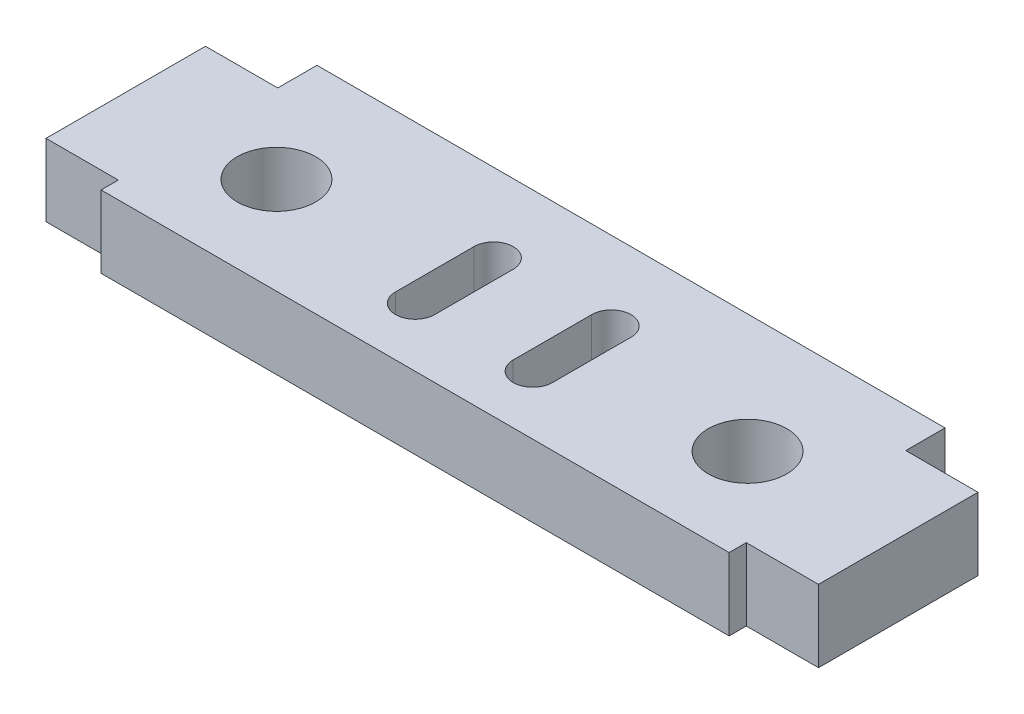
ISO-10303-21;
HEADER;
FILE_DESCRIPTION(('STEP AP214'),'2;1');
FILE_NAME('part.step','',(''),(''),'','','');
FILE_SCHEMA(('AUTOMOTIVE_DESIGN { 1 0 10303 214 1 1 1 1 }'));
ENDSEC;
DATA;
#1=APPLICATION_CONTEXT('core data for automotive mechanical design processes');
#2=APPLICATION_PROTOCOL_DEFINITION('international standard','automotive_design',2000,#1);
#3=PRODUCT_CONTEXT('',#1,'mechanical');
#4=PRODUCT('Part','Part','',(#3));
#5=PRODUCT_RELATED_PRODUCT_CATEGORY('part','',(#4));
#6=PRODUCT_DEFINITION_FORMATION('','',#4);
#7=PRODUCT_DEFINITION_CONTEXT('part definition',#1,'design');
#8=PRODUCT_DEFINITION('design','',#6,#7);
#9=PRODUCT_DEFINITION_SHAPE('','',#8);
#10=(LENGTH_UNIT() NAMED_UNIT(*) SI_UNIT(.MILLI.,.METRE.));
#11=(NAMED_UNIT(*) PLANE_ANGLE_UNIT() SI_UNIT($,.RADIAN.));
#12=(NAMED_UNIT(*) SI_UNIT($,.STERADIAN.) SOLID_ANGLE_UNIT());
#13=UNCERTAINTY_MEASURE_WITH_UNIT(LENGTH_MEASURE(1.E-05),#10,'distance_accuracy_value','');
#14=(GEOMETRIC_REPRESENTATION_CONTEXT(3) GLOBAL_UNCERTAINTY_ASSIGNED_CONTEXT((#13)) GLOBAL_UNIT_ASSIGNED_CONTEXT((#10,
#11,#12)) REPRESENTATION_CONTEXT('',''));
#15=CARTESIAN_POINT('',(0.,0.,0.));
#16=DIRECTION('',(0.,0.,1.));
#17=DIRECTION('',(1.,0.,0.));
#18=AXIS2_PLACEMENT_3D('',#15,#16,#17);
#19=CARTESIAN_POINT('',(-25.4,5.842,-6.450000054));
#20=DIRECTION('',(1.,0.,0.));
#21=DIRECTION('',(0.,0.,-1.));
#22=AXIS2_PLACEMENT_3D('',#19,#20,#21);
#23=PLANE('',#22);
#24=DIRECTION('',(0.,0.,1.));
#25=VECTOR('',#24,1.);
#26=CARTESIAN_POINT('',(-25.4,0.,-6.450000054));
#27=LINE('',#26,#25);
#28=CARTESIAN_POINT('',(-25.4,0.,-9.625000054));
#29=VERTEX_POINT('',#28);
#30=CARTESIAN_POINT('',(-25.4,0.,-6.450000054));
#31=VERTEX_POINT('',#30);
#32=EDGE_CURVE('E195',#29,#31,#27,.T.);
#33=ORIENTED_EDGE('',*,*,#32,.T.);
#34=DIRECTION('',(0.,-1.,0.));
#35=VECTOR('',#34,1.);
#36=CARTESIAN_POINT('',(-25.4,5.842,-6.450000054));
#37=LINE('',#36,#35);
#38=CARTESIAN_POINT('',(-25.4,5.842,-6.450000054));
#39=VERTEX_POINT('',#38);
#40=EDGE_CURVE('E11',#39,#31,#37,.T.);
#41=ORIENTED_EDGE('',*,*,#40,.F.);
#42=DIRECTION('',(0.,0.,1.));
#43=VECTOR('',#42,1.);
#44=CARTESIAN_POINT('',(-25.4,5.842,-6.450000054));
#45=LINE('',#44,#43);
#46=CARTESIAN_POINT('',(-25.4,5.842,-9.625000054));
#47=VERTEX_POINT('',#46);
#48=EDGE_CURVE('E182',#47,#39,#45,.T.);
#49=ORIENTED_EDGE('',*,*,#48,.F.);
#50=DIRECTION('',(0.,-1.,0.));
#51=VECTOR('',#50,1.);
#52=CARTESIAN_POINT('',(-25.4,56.6667986346232,-9.625000054));
#53=LINE('',#52,#51);
#54=EDGE_CURVE('E197',#47,#29,#53,.T.);
#55=ORIENTED_EDGE('',*,*,#54,.T.);
#56=EDGE_LOOP('',(#33,#41,#49,#55));
#57=FACE_BOUND('',#56,.T.);
#58=ADVANCED_FACE('F34',(#57),#23,.F.);
#59=CARTESIAN_POINT('',(-31.242,5.842,-6.450000054));
#60=DIRECTION('',(0.,0.,1.));
#61=DIRECTION('',(1.,0.,0.));
#62=AXIS2_PLACEMENT_3D('',#59,#60,#61);
#63=PLANE('',#62);
#64=DIRECTION('',(-1.,0.,0.));
#65=VECTOR('',#64,1.);
#66=CARTESIAN_POINT('',(-31.242,0.,-6.450000054));
#67=LINE('',#66,#65);
#68=CARTESIAN_POINT('',(-31.242,0.,-6.450000054));
#69=VERTEX_POINT('',#68);
#70=EDGE_CURVE('E297',#31,#69,#67,.T.);
#71=ORIENTED_EDGE('',*,*,#70,.T.);
#72=DIRECTION('',(0.,-1.,0.));
#73=VECTOR('',#72,1.);
#74=CARTESIAN_POINT('',(-31.242,5.842,-6.450000054));
#75=LINE('',#74,#73);
#76=CARTESIAN_POINT('',(-31.242,5.842,-6.450000054));
#77=VERTEX_POINT('',#76);
#78=EDGE_CURVE('E41',#77,#69,#75,.T.);
#79=ORIENTED_EDGE('',*,*,#78,.F.);
#80=DIRECTION('',(-1.,0.,0.));
#81=VECTOR('',#80,1.);
#82=CARTESIAN_POINT('',(-31.242,5.842,-6.450000054));
#83=LINE('',#82,#81);
#84=EDGE_CURVE('E276',#39,#77,#83,.T.);
#85=ORIENTED_EDGE('',*,*,#84,.F.);
#86=ORIENTED_EDGE('',*,*,#40,.T.);
#87=EDGE_LOOP('',(#71,#79,#85,#86));
#88=FACE_BOUND('',#87,.T.);
#89=ADVANCED_FACE('F359',(#88),#63,.F.);
#90=CARTESIAN_POINT('',(-31.242,5.842,6.45000005400001));
#91=DIRECTION('',(1.,0.,0.));
#92=DIRECTION('',(0.,0.,-1.));
#93=AXIS2_PLACEMENT_3D('',#90,#91,#92);
#94=PLANE('',#93);
#95=DIRECTION('',(0.,0.,1.));
#96=VECTOR('',#95,1.);
#97=CARTESIAN_POINT('',(-31.242,0.,6.45000005400001));
#98=LINE('',#97,#96);
#99=CARTESIAN_POINT('',(-31.242,0.,6.45000005400001));
#100=VERTEX_POINT('',#99);
#101=EDGE_CURVE('E299',#69,#100,#98,.T.);
#102=ORIENTED_EDGE('',*,*,#101,.T.);
#103=DIRECTION('',(0.,-1.,0.));
#104=VECTOR('',#103,1.);
#105=CARTESIAN_POINT('',(-31.242,5.842,6.45000005400001));
#106=LINE('',#105,#104);
#107=CARTESIAN_POINT('',(-31.242,5.842,6.45000005400001));
#108=VERTEX_POINT('',#107);
#109=EDGE_CURVE('E333',#108,#100,#106,.T.);
#110=ORIENTED_EDGE('',*,*,#109,.F.);
#111=DIRECTION('',(0.,0.,1.));
#112=VECTOR('',#111,1.);
#113=CARTESIAN_POINT('',(-31.242,5.842,6.45000005400001));
#114=LINE('',#113,#112);
#115=EDGE_CURVE('E278',#77,#108,#114,.T.);
#116=ORIENTED_EDGE('',*,*,#115,.F.);
#117=ORIENTED_EDGE('',*,*,#78,.T.);
#118=EDGE_LOOP('',(#102,#110,#116,#117));
#119=FACE_BOUND('',#118,.T.);
#120=ADVANCED_FACE('F340',(#119),#94,.F.);
#121=CARTESIAN_POINT('',(-31.242,5.842,6.45000005400001));
#122=DIRECTION('',(0.,0.,-1.));
#123=DIRECTION('',(-1.,0.,0.));
#124=AXIS2_PLACEMENT_3D('',#121,#122,#123);
#125=PLANE('',#124);
#126=DIRECTION('',(1.,0.,0.));
#127=VECTOR('',#126,1.);
#128=CARTESIAN_POINT('',(-31.242,0.,6.45000005400001));
#129=LINE('',#128,#127);
#130=CARTESIAN_POINT('',(-25.4,0.,6.45000005400001));
#131=VERTEX_POINT('',#130);
#132=EDGE_CURVE('E301',#100,#131,#129,.T.);
#133=ORIENTED_EDGE('',*,*,#132,.T.);
#134=DIRECTION('',(0.,-1.,0.));
#135=VECTOR('',#134,1.);
#136=CARTESIAN_POINT('',(-25.4,5.842,6.45000005400001));
#137=LINE('',#136,#135);
#138=CARTESIAN_POINT('',(-25.4,5.842,6.45000005400001));
#139=VERTEX_POINT('',#138);
#140=EDGE_CURVE('E330',#139,#131,#137,.T.);
#141=ORIENTED_EDGE('',*,*,#140,.F.);
#142=DIRECTION('',(1.,0.,0.));
#143=VECTOR('',#142,1.);
#144=CARTESIAN_POINT('',(-31.242,5.842,6.45000005400001));
#145=LINE('',#144,#143);
#146=EDGE_CURVE('E280',#108,#139,#145,.T.);
#147=ORIENTED_EDGE('',*,*,#146,.F.);
#148=ORIENTED_EDGE('',*,*,#109,.T.);
#149=EDGE_LOOP('',(#133,#141,#147,#148));
#150=FACE_BOUND('',#149,.T.);
#151=ADVANCED_FACE('F348',(#150),#125,.F.);
#152=CARTESIAN_POINT('',(-25.4,5.842,7.837499946));
#153=DIRECTION('',(1.,0.,0.));
#154=DIRECTION('',(0.,0.,-1.));
#155=AXIS2_PLACEMENT_3D('',#152,#153,#154);
#156=PLANE('',#155);
#157=DIRECTION('',(0.,0.,1.));
#158=VECTOR('',#157,1.);
#159=CARTESIAN_POINT('',(-25.4,0.,7.837499946));
#160=LINE('',#159,#158);
#161=CARTESIAN_POINT('',(-25.4,0.,7.837499946));
#162=VERTEX_POINT('',#161);
#163=EDGE_CURVE('E303',#131,#162,#160,.T.);
#164=ORIENTED_EDGE('',*,*,#163,.T.);
#165=DIRECTION('',(0.,-1.,0.));
#166=VECTOR('',#165,1.);
#167=CARTESIAN_POINT('',(-25.4,5.842,7.837499946));
#168=LINE('',#167,#166);
#169=CARTESIAN_POINT('',(-25.4,5.842,7.837499946));
#170=VERTEX_POINT('',#169);
#171=EDGE_CURVE('E327',#170,#162,#168,.T.);
#172=ORIENTED_EDGE('',*,*,#171,.F.);
#173=DIRECTION('',(0.,0.,1.));
#174=VECTOR('',#173,1.);
#175=CARTESIAN_POINT('',(-25.4,5.842,7.837499946));
#176=LINE('',#175,#174);
#177=EDGE_CURVE('E282',#139,#170,#176,.T.);
#178=ORIENTED_EDGE('',*,*,#177,.F.);
#179=ORIENTED_EDGE('',*,*,#140,.T.);
#180=EDGE_LOOP('',(#164,#172,#178,#179));
#181=FACE_BOUND('',#180,.T.);
#182=ADVANCED_FACE('F352',(#181),#156,.F.);
#183=CARTESIAN_POINT('',(25.4,5.842,7.837499946));
#184=DIRECTION('',(0.,0.,-1.));
#185=DIRECTION('',(-1.,0.,0.));
#186=AXIS2_PLACEMENT_3D('',#183,#184,#185);
#187=PLANE('',#186);
#188=DIRECTION('',(1.,0.,0.));
#189=VECTOR('',#188,1.);
#190=CARTESIAN_POINT('',(25.4,0.,7.837499946));
#191=LINE('',#190,#189);
#192=CARTESIAN_POINT('',(25.4,0.,7.837499946));
#193=VERTEX_POINT('',#192);
#194=EDGE_CURVE('E305',#162,#193,#191,.T.);
#195=ORIENTED_EDGE('',*,*,#194,.T.);
#196=DIRECTION('',(0.,-1.,0.));
#197=VECTOR('',#196,1.);
#198=CARTESIAN_POINT('',(25.4,5.842,7.837499946));
#199=LINE('',#198,#197);
#200=CARTESIAN_POINT('',(25.4,5.842,7.837499946));
#201=VERTEX_POINT('',#200);
#202=EDGE_CURVE('E324',#201,#193,#199,.T.);
#203=ORIENTED_EDGE('',*,*,#202,.F.);
#204=DIRECTION('',(1.,0.,0.));
#205=VECTOR('',#204,1.);
#206=CARTESIAN_POINT('',(25.4,5.842,7.837499946));
#207=LINE('',#206,#205);
#208=EDGE_CURVE('E284',#170,#201,#207,.T.);
#209=ORIENTED_EDGE('',*,*,#208,.F.);
#210=ORIENTED_EDGE('',*,*,#171,.T.);
#211=EDGE_LOOP('',(#195,#203,#209,#210));
#212=FACE_BOUND('',#211,.T.);
#213=ADVANCED_FACE('F380',(#212),#187,.F.);
#214=CARTESIAN_POINT('',(25.4,5.842,7.837499946));
#215=DIRECTION('',(-1.,0.,0.));
#216=DIRECTION('',(0.,0.,1.));
#217=AXIS2_PLACEMENT_3D('',#214,#215,#216);
#218=PLANE('',#217);
#219=DIRECTION('',(0.,0.,-1.));
#220=VECTOR('',#219,1.);
#221=CARTESIAN_POINT('',(25.4,0.,7.837499946));
#222=LINE('',#221,#220);
#223=CARTESIAN_POINT('',(25.4,0.,6.45000005400002));
#224=VERTEX_POINT('',#223);
#225=EDGE_CURVE('E307',#193,#224,#222,.T.);
#226=ORIENTED_EDGE('',*,*,#225,.T.);
#227=DIRECTION('',(0.,-1.,0.));
#228=VECTOR('',#227,1.);
#229=CARTESIAN_POINT('',(25.4,5.842,6.45000005400002));
#230=LINE('',#229,#228);
#231=CARTESIAN_POINT('',(25.4,5.842,6.45000005400002));
#232=VERTEX_POINT('',#231);
#233=EDGE_CURVE('E321',#232,#224,#230,.T.);
#234=ORIENTED_EDGE('',*,*,#233,.F.);
#235=DIRECTION('',(0.,0.,-1.));
#236=VECTOR('',#235,1.);
#237=CARTESIAN_POINT('',(25.4,5.842,7.837499946));
#238=LINE('',#237,#236);
#239=EDGE_CURVE('E286',#201,#232,#238,.T.);
#240=ORIENTED_EDGE('',*,*,#239,.F.);
#241=ORIENTED_EDGE('',*,*,#202,.T.);
#242=EDGE_LOOP('',(#226,#234,#240,#241));
#243=FACE_BOUND('',#242,.T.);
#244=ADVANCED_FACE('F378',(#243),#218,.F.);
#245=CARTESIAN_POINT('',(31.242,5.842,6.45000005399999));
#246=DIRECTION('',(0.,0.,-1.));
#247=DIRECTION('',(-1.,0.,0.));
#248=AXIS2_PLACEMENT_3D('',#245,#246,#247);
#249=PLANE('',#248);
#250=DIRECTION('',(1.,0.,0.));
#251=VECTOR('',#250,1.);
#252=CARTESIAN_POINT('',(31.242,0.,6.45000005399999));
#253=LINE('',#252,#251);
#254=CARTESIAN_POINT('',(31.242,0.,6.45000005399999));
#255=VERTEX_POINT('',#254);
#256=EDGE_CURVE('E309',#224,#255,#253,.T.);
#257=ORIENTED_EDGE('',*,*,#256,.T.);
#258=DIRECTION('',(0.,-1.,0.));
#259=VECTOR('',#258,1.);
#260=CARTESIAN_POINT('',(31.242,5.842,6.45000005399999));
#261=LINE('',#260,#259);
#262=CARTESIAN_POINT('',(31.242,5.842,6.45000005399999));
#263=VERTEX_POINT('',#262);
#264=EDGE_CURVE('E318',#263,#255,#261,.T.);
#265=ORIENTED_EDGE('',*,*,#264,.F.);
#266=DIRECTION('',(1.,0.,0.));
#267=VECTOR('',#266,1.);
#268=CARTESIAN_POINT('',(31.242,5.842,6.45000005399999));
#269=LINE('',#268,#267);
#270=EDGE_CURVE('E288',#232,#263,#269,.T.);
#271=ORIENTED_EDGE('',*,*,#270,.F.);
#272=ORIENTED_EDGE('',*,*,#233,.T.);
#273=EDGE_LOOP('',(#257,#265,#271,#272));
#274=FACE_BOUND('',#273,.T.);
#275=ADVANCED_FACE('F374',(#274),#249,.F.);
#276=CARTESIAN_POINT('',(31.242,5.842,6.45000005399999));
#277=DIRECTION('',(-1.,0.,0.));
#278=DIRECTION('',(0.,0.,1.));
#279=AXIS2_PLACEMENT_3D('',#276,#277,#278);
#280=PLANE('',#279);
#281=DIRECTION('',(0.,0.,-1.));
#282=VECTOR('',#281,1.);
#283=CARTESIAN_POINT('',(31.242,0.,6.45000005399999));
#284=LINE('',#283,#282);
#285=CARTESIAN_POINT('',(31.242,0.,-6.45000005400001));
#286=VERTEX_POINT('',#285);
#287=EDGE_CURVE('E311',#255,#286,#284,.T.);
#288=ORIENTED_EDGE('',*,*,#287,.T.);
#289=DIRECTION('',(0.,-1.,0.));
#290=VECTOR('',#289,1.);
#291=CARTESIAN_POINT('',(31.242,5.842,-6.45000005400001));
#292=LINE('',#291,#290);
#293=CARTESIAN_POINT('',(31.242,5.842,-6.45000005400001));
#294=VERTEX_POINT('',#293);
#295=EDGE_CURVE('E315',#294,#286,#292,.T.);
#296=ORIENTED_EDGE('',*,*,#295,.F.);
#297=DIRECTION('',(0.,0.,-1.));
#298=VECTOR('',#297,1.);
#299=CARTESIAN_POINT('',(31.242,5.842,6.45000005399999));
#300=LINE('',#299,#298);
#301=EDGE_CURVE('E290',#263,#294,#300,.T.);
#302=ORIENTED_EDGE('',*,*,#301,.F.);
#303=ORIENTED_EDGE('',*,*,#264,.T.);
#304=EDGE_LOOP('',(#288,#296,#302,#303));
#305=FACE_BOUND('',#304,.T.);
#306=ADVANCED_FACE('F370',(#305),#280,.F.);
#307=CARTESIAN_POINT('',(31.242,5.842,-6.45000005400001));
#308=DIRECTION('',(0.,0.,1.));
#309=DIRECTION('',(1.,0.,0.));
#310=AXIS2_PLACEMENT_3D('',#307,#308,#309);
#311=PLANE('',#310);
#312=DIRECTION('',(-1.,0.,0.));
#313=VECTOR('',#312,1.);
#314=CARTESIAN_POINT('',(31.242,0.,-6.45000005400001));
#315=LINE('',#314,#313);
#316=CARTESIAN_POINT('',(25.4,0.,-6.450000054));
#317=VERTEX_POINT('',#316);
#318=EDGE_CURVE('E183',#286,#317,#315,.T.);
#319=ORIENTED_EDGE('',*,*,#318,.T.);
#320=DIRECTION('',(0.,-1.,0.));
#321=VECTOR('',#320,1.);
#322=CARTESIAN_POINT('',(25.4,5.842,-6.450000054));
#323=LINE('',#322,#321);
#324=CARTESIAN_POINT('',(25.4,5.842,-6.450000054));
#325=VERTEX_POINT('',#324);
#326=EDGE_CURVE('E178',#325,#317,#323,.T.);
#327=ORIENTED_EDGE('',*,*,#326,.F.);
#328=DIRECTION('',(-1.,0.,0.));
#329=VECTOR('',#328,1.);
#330=CARTESIAN_POINT('',(31.242,5.842,-6.45000005400001));
#331=LINE('',#330,#329);
#332=EDGE_CURVE('E292',#294,#325,#331,.T.);
#333=ORIENTED_EDGE('',*,*,#332,.F.);
#334=ORIENTED_EDGE('',*,*,#295,.T.);
#335=EDGE_LOOP('',(#319,#327,#333,#334));
#336=FACE_BOUND('',#335,.T.);
#337=ADVANCED_FACE('F365',(#336),#311,.F.);
#338=CARTESIAN_POINT('',(25.4,5.842,-6.450000054));
#339=DIRECTION('',(-1.,0.,0.));
#340=DIRECTION('',(0.,0.,1.));
#341=AXIS2_PLACEMENT_3D('',#338,#339,#340);
#342=PLANE('',#341);
#343=DIRECTION('',(0.,0.,-1.));
#344=VECTOR('',#343,1.);
#345=CARTESIAN_POINT('',(25.4,0.,-6.450000054));
#346=LINE('',#345,#344);
#347=CARTESIAN_POINT('',(25.4,0.,-9.625000054));
#348=VERTEX_POINT('',#347);
#349=EDGE_CURVE('E171',#317,#348,#346,.T.);
#350=ORIENTED_EDGE('',*,*,#349,.T.);
#351=DIRECTION('',(0.,-1.,0.));
#352=VECTOR('',#351,1.);
#353=CARTESIAN_POINT('',(25.4,56.6667986346232,-9.625000054));
#354=LINE('',#353,#352);
#355=CARTESIAN_POINT('',(25.4,5.842,-9.625000054));
#356=VERTEX_POINT('',#355);
#357=EDGE_CURVE('E175',#356,#348,#354,.T.);
#358=ORIENTED_EDGE('',*,*,#357,.F.);
#359=DIRECTION('',(0.,0.,-1.));
#360=VECTOR('',#359,1.);
#361=CARTESIAN_POINT('',(25.4,5.842,-6.450000054));
#362=LINE('',#361,#360);
#363=EDGE_CURVE('E294',#325,#356,#362,.T.);
#364=ORIENTED_EDGE('',*,*,#363,.F.);
#365=ORIENTED_EDGE('',*,*,#326,.T.);
#366=EDGE_LOOP('',(#350,#358,#364,#365));
#367=FACE_BOUND('',#366,.T.);
#368=ADVANCED_FACE('F173',(#367),#342,.F.);
#369=CARTESIAN_POINT('',(0.,5.842,0.));
#370=DIRECTION('',(0.,1.,0.));
#371=DIRECTION('',(0.,0.,1.));
#372=AXIS2_PLACEMENT_3D('',#369,#370,#371);
#373=PLANE('',#372);
#374=CARTESIAN_POINT('',(4.7625,5.842,3.07499994599999));
#375=DIRECTION('',(0.,-1.,0.));
#376=DIRECTION('',(0.,0.,1.));
#377=AXIS2_PLACEMENT_3D('',#374,#375,#376);
#378=CIRCLE('',#377,1.5875);
#379=CARTESIAN_POINT('',(6.35,5.842,3.07499994599999));
#380=VERTEX_POINT('',#379);
#381=CARTESIAN_POINT('',(3.175,5.842,3.07499994599999));
#382=VERTEX_POINT('',#381);
#383=EDGE_CURVE('E202',#380,#382,#378,.T.);
#384=ORIENTED_EDGE('',*,*,#383,.T.);
#385=DIRECTION('',(0.,0.,-1.));
#386=VECTOR('',#385,1.);
#387=CARTESIAN_POINT('',(3.175,5.842,3.07499994599999));
#388=LINE('',#387,#386);
#389=CARTESIAN_POINT('',(3.175,5.842,-3.27500005400001));
#390=VERTEX_POINT('',#389);
#391=EDGE_CURVE('E205',#382,#390,#388,.T.);
#392=ORIENTED_EDGE('',*,*,#391,.T.);
#393=CARTESIAN_POINT('',(4.7625,5.842,-3.27500005400001));
#394=DIRECTION('',(0.,-1.,0.));
#395=DIRECTION('',(0.,0.,1.));
#396=AXIS2_PLACEMENT_3D('',#393,#394,#395);
#397=CIRCLE('',#396,1.5875);
#398=CARTESIAN_POINT('',(6.35,5.842,-3.27500005400001));
#399=VERTEX_POINT('',#398);
#400=EDGE_CURVE('E48',#390,#399,#397,.T.);
#401=ORIENTED_EDGE('',*,*,#400,.T.);
#402=DIRECTION('',(0.,0.,1.));
#403=VECTOR('',#402,1.);
#404=CARTESIAN_POINT('',(6.35,5.842,3.07499994599999));
#405=LINE('',#404,#403);
#406=EDGE_CURVE('E210',#399,#380,#405,.T.);
#407=ORIENTED_EDGE('',*,*,#406,.T.);
#408=EDGE_LOOP('',(#384,#392,#401,#407));
#409=FACE_BOUND('',#408,.T.);
#410=CARTESIAN_POINT('',(-4.7625,5.842,3.07499994599999));
#411=DIRECTION('',(0.,-1.,0.));
#412=DIRECTION('',(0.,0.,-1.));
#413=AXIS2_PLACEMENT_3D('',#410,#411,#412);
#414=CIRCLE('',#413,1.5875);
#415=CARTESIAN_POINT('',(-3.175,5.842,3.07499994599999));
#416=VERTEX_POINT('',#415);
#417=CARTESIAN_POINT('',(-6.35,5.842,3.07499994599999));
#418=VERTEX_POINT('',#417);
#419=EDGE_CURVE('E231',#416,#418,#414,.T.);
#420=ORIENTED_EDGE('',*,*,#419,.T.);
#421=DIRECTION('',(0.,0.,-1.));
#422=VECTOR('',#421,1.);
#423=CARTESIAN_POINT('',(-6.35,5.842,3.07499994599999));
#424=LINE('',#423,#422);
#425=CARTESIAN_POINT('',(-6.35,5.842,-3.27500005400001));
#426=VERTEX_POINT('',#425);
#427=EDGE_CURVE('E234',#418,#426,#424,.T.);
#428=ORIENTED_EDGE('',*,*,#427,.T.);
#429=CARTESIAN_POINT('',(-4.7625,5.842,-3.27500005400001));
#430=DIRECTION('',(0.,-1.,0.));
#431=DIRECTION('',(0.,0.,-1.));
#432=AXIS2_PLACEMENT_3D('',#429,#430,#431);
#433=CIRCLE('',#432,1.5875);
#434=CARTESIAN_POINT('',(-3.175,5.842,-3.27500005400001));
#435=VERTEX_POINT('',#434);
#436=EDGE_CURVE('E238',#426,#435,#433,.T.);
#437=ORIENTED_EDGE('',*,*,#436,.T.);
#438=DIRECTION('',(0.,0.,1.));
#439=VECTOR('',#438,1.);
#440=CARTESIAN_POINT('',(-3.175,5.842,3.07499994599999));
#441=LINE('',#440,#439);
#442=EDGE_CURVE('E241',#435,#416,#441,.T.);
#443=ORIENTED_EDGE('',*,*,#442,.T.);
#444=EDGE_LOOP('',(#420,#428,#437,#443));
#445=FACE_BOUND('',#444,.T.);
#446=CARTESIAN_POINT('',(19.05,5.842,0.));
#447=DIRECTION('',(0.,1.,0.));
#448=DIRECTION('',(0.,0.,-1.));
#449=AXIS2_PLACEMENT_3D('',#446,#447,#448);
#450=CIRCLE('',#449,3.175);
#451=CARTESIAN_POINT('',(19.05,5.842,-3.17499999999999));
#452=VERTEX_POINT('',#451);
#453=EDGE_CURVE('E256',#452,#452,#450,.T.);
#454=ORIENTED_EDGE('',*,*,#453,.F.);
#455=EDGE_LOOP('',(#454));
#456=FACE_BOUND('',#455,.T.);
#457=CARTESIAN_POINT('',(-19.05,5.842,0.));
#458=DIRECTION('',(0.,1.,0.));
#459=DIRECTION('',(0.,0.,1.));
#460=AXIS2_PLACEMENT_3D('',#457,#458,#459);
#461=CIRCLE('',#460,3.175);
#462=CARTESIAN_POINT('',(-19.05,5.842,3.17500000000001));
#463=VERTEX_POINT('',#462);
#464=EDGE_CURVE('E266',#463,#463,#461,.T.);
#465=ORIENTED_EDGE('',*,*,#464,.F.);
#466=EDGE_LOOP('',(#465));
#467=FACE_BOUND('',#466,.T.);
#468=ORIENTED_EDGE('',*,*,#48,.T.);
#469=ORIENTED_EDGE('',*,*,#84,.T.);
#470=ORIENTED_EDGE('',*,*,#115,.T.);
#471=ORIENTED_EDGE('',*,*,#146,.T.);
#472=ORIENTED_EDGE('',*,*,#177,.T.);
#473=ORIENTED_EDGE('',*,*,#208,.T.);
#474=ORIENTED_EDGE('',*,*,#239,.T.);
#475=ORIENTED_EDGE('',*,*,#270,.T.);
#476=ORIENTED_EDGE('',*,*,#301,.T.);
#477=ORIENTED_EDGE('',*,*,#332,.T.);
#478=ORIENTED_EDGE('',*,*,#363,.T.);
#479=DIRECTION('',(1.,0.,0.));
#480=VECTOR('',#479,1.);
#481=CARTESIAN_POINT('',(25.4,5.842,-9.625000054));
#482=LINE('',#481,#480);
#483=EDGE_CURVE('E191',#47,#356,#482,.T.);
#484=ORIENTED_EDGE('',*,*,#483,.F.);
#485=EDGE_LOOP('',(#468,#469,#470,#471,#472,#473,#474,#475,#476,#477,#478,#484));
#486=FACE_BOUND('',#485,.T.);
#487=ADVANCED_FACE('F356',(#409,#445,#456,#467,#486),#373,.T.);
#488=CARTESIAN_POINT('',(0.,0.,0.));
#489=DIRECTION('',(0.,1.,0.));
#490=DIRECTION('',(0.,0.,1.));
#491=AXIS2_PLACEMENT_3D('',#488,#489,#490);
#492=PLANE('',#491);
#493=DIRECTION('',(0.,0.,-1.));
#494=VECTOR('',#493,1.);
#495=CARTESIAN_POINT('',(3.175,0.,3.07499994599999));
#496=LINE('',#495,#494);
#497=CARTESIAN_POINT('',(3.175,0.,3.07499994599999));
#498=VERTEX_POINT('',#497);
#499=CARTESIAN_POINT('',(3.175,0.,-3.27500005400001));
#500=VERTEX_POINT('',#499);
#501=EDGE_CURVE('E215',#498,#500,#496,.T.);
#502=ORIENTED_EDGE('',*,*,#501,.F.);
#503=CARTESIAN_POINT('',(4.7625,0.,3.07499994599999));
#504=DIRECTION('',(0.,-1.,0.));
#505=DIRECTION('',(0.,0.,1.));
#506=AXIS2_PLACEMENT_3D('',#503,#504,#505);
#507=CIRCLE('',#506,1.5875);
#508=CARTESIAN_POINT('',(6.35,0.,3.07499994599999));
#509=VERTEX_POINT('',#508);
#510=EDGE_CURVE('E56',#509,#498,#507,.T.);
#511=ORIENTED_EDGE('',*,*,#510,.F.);
#512=DIRECTION('',(0.,0.,1.));
#513=VECTOR('',#512,1.);
#514=CARTESIAN_POINT('',(6.35,0.,3.07499994599999));
#515=LINE('',#514,#513);
#516=CARTESIAN_POINT('',(6.35,0.,-3.27500005400001));
#517=VERTEX_POINT('',#516);
#518=EDGE_CURVE('E206',#517,#509,#515,.T.);
#519=ORIENTED_EDGE('',*,*,#518,.F.);
#520=CARTESIAN_POINT('',(4.7625,0.,-3.27500005400001));
#521=DIRECTION('',(0.,-1.,0.));
#522=DIRECTION('',(0.,0.,1.));
#523=AXIS2_PLACEMENT_3D('',#520,#521,#522);
#524=CIRCLE('',#523,1.5875);
#525=EDGE_CURVE('E218',#500,#517,#524,.T.);
#526=ORIENTED_EDGE('',*,*,#525,.F.);
#527=EDGE_LOOP('',(#502,#511,#519,#526));
#528=FACE_BOUND('',#527,.T.);
#529=DIRECTION('',(0.,0.,-1.));
#530=VECTOR('',#529,1.);
#531=CARTESIAN_POINT('',(-6.35,0.,3.07499994599999));
#532=LINE('',#531,#530);
#533=CARTESIAN_POINT('',(-6.35,0.,3.07499994599999));
#534=VERTEX_POINT('',#533);
#535=CARTESIAN_POINT('',(-6.35,0.,-3.27500005400001));
#536=VERTEX_POINT('',#535);
#537=EDGE_CURVE('E246',#534,#536,#532,.T.);
#538=ORIENTED_EDGE('',*,*,#537,.F.);
#539=CARTESIAN_POINT('',(-4.7625,0.,3.07499994599999));
#540=DIRECTION('',(0.,-1.,0.));
#541=DIRECTION('',(0.,0.,-1.));
#542=AXIS2_PLACEMENT_3D('',#539,#540,#541);
#543=CIRCLE('',#542,1.5875);
#544=CARTESIAN_POINT('',(-3.175,0.,3.07499994599999));
#545=VERTEX_POINT('',#544);
#546=EDGE_CURVE('E225',#545,#534,#543,.T.);
#547=ORIENTED_EDGE('',*,*,#546,.F.);
#548=DIRECTION('',(0.,0.,1.));
#549=VECTOR('',#548,1.);
#550=CARTESIAN_POINT('',(-3.175,0.,3.07499994599999));
#551=LINE('',#550,#549);
#552=CARTESIAN_POINT('',(-3.175,0.,-3.27500005400001));
#553=VERTEX_POINT('',#552);
#554=EDGE_CURVE('E235',#553,#545,#551,.T.);
#555=ORIENTED_EDGE('',*,*,#554,.F.);
#556=CARTESIAN_POINT('',(-4.7625,0.,-3.27500005400001));
#557=DIRECTION('',(0.,-1.,0.));
#558=DIRECTION('',(0.,0.,-1.));
#559=AXIS2_PLACEMENT_3D('',#556,#557,#558);
#560=CIRCLE('',#559,1.5875);
#561=EDGE_CURVE('E249',#536,#553,#560,.T.);
#562=ORIENTED_EDGE('',*,*,#561,.F.);
#563=EDGE_LOOP('',(#538,#547,#555,#562));
#564=FACE_BOUND('',#563,.T.);
#565=CARTESIAN_POINT('',(19.05,0.,0.));
#566=DIRECTION('',(0.,1.,0.));
#567=DIRECTION('',(0.,0.,-1.));
#568=AXIS2_PLACEMENT_3D('',#565,#566,#567);
#569=CIRCLE('',#568,3.175);
#570=CARTESIAN_POINT('',(19.05,0.,-3.17499999999999));
#571=VERTEX_POINT('',#570);
#572=EDGE_CURVE('E263',#571,#571,#569,.T.);
#573=ORIENTED_EDGE('',*,*,#572,.T.);
#574=EDGE_LOOP('',(#573));
#575=FACE_BOUND('',#574,.T.);
#576=CARTESIAN_POINT('',(-19.05,0.,0.));
#577=DIRECTION('',(0.,1.,0.));
#578=DIRECTION('',(0.,0.,1.));
#579=AXIS2_PLACEMENT_3D('',#576,#577,#578);
#580=CIRCLE('',#579,3.175);
#581=CARTESIAN_POINT('',(-19.05,0.,3.17500000000001));
#582=VERTEX_POINT('',#581);
#583=EDGE_CURVE('E269',#582,#582,#580,.T.);
#584=ORIENTED_EDGE('',*,*,#583,.T.);
#585=EDGE_LOOP('',(#584));
#586=FACE_BOUND('',#585,.T.);
#587=ORIENTED_EDGE('',*,*,#32,.F.);
#588=DIRECTION('',(1.,0.,0.));
#589=VECTOR('',#588,1.);
#590=CARTESIAN_POINT('',(25.4,0.,-9.625000054));
#591=LINE('',#590,#589);
#592=EDGE_CURVE('E189',#29,#348,#591,.T.);
#593=ORIENTED_EDGE('',*,*,#592,.T.);
#594=ORIENTED_EDGE('',*,*,#349,.F.);
#595=ORIENTED_EDGE('',*,*,#318,.F.);
#596=ORIENTED_EDGE('',*,*,#287,.F.);
#597=ORIENTED_EDGE('',*,*,#256,.F.);
#598=ORIENTED_EDGE('',*,*,#225,.F.);
#599=ORIENTED_EDGE('',*,*,#194,.F.);
#600=ORIENTED_EDGE('',*,*,#163,.F.);
#601=ORIENTED_EDGE('',*,*,#132,.F.);
#602=ORIENTED_EDGE('',*,*,#101,.F.);
#603=ORIENTED_EDGE('',*,*,#70,.F.);
#604=EDGE_LOOP('',(#587,#593,#594,#595,#596,#597,#598,#599,#600,#601,#602,#603));
#605=FACE_BOUND('',#604,.T.);
#606=ADVANCED_FACE('F193',(#528,#564,#575,#586,#605),#492,.F.);
#607=CARTESIAN_POINT('',(-19.05,0.,0.));
#608=DIRECTION('',(0.,1.,0.));
#609=DIRECTION('',(0.,0.,1.));
#610=AXIS2_PLACEMENT_3D('',#607,#608,#609);
#611=CYLINDRICAL_SURFACE('',#610,3.175);
#612=ORIENTED_EDGE('',*,*,#583,.F.);
#613=EDGE_LOOP('',(#612));
#614=FACE_BOUND('',#613,.T.);
#615=ORIENTED_EDGE('',*,*,#464,.T.);
#616=EDGE_LOOP('',(#615));
#617=FACE_BOUND('',#616,.T.);
#618=ADVANCED_FACE('F448',(#614,#617),#611,.F.);
#619=CARTESIAN_POINT('',(19.05,0.,0.));
#620=DIRECTION('',(0.,1.,0.));
#621=DIRECTION('',(0.,0.,1.));
#622=AXIS2_PLACEMENT_3D('',#619,#620,#621);
#623=CYLINDRICAL_SURFACE('',#622,3.175);
#624=ORIENTED_EDGE('',*,*,#572,.F.);
#625=EDGE_LOOP('',(#624));
#626=FACE_BOUND('',#625,.T.);
#627=ORIENTED_EDGE('',*,*,#453,.T.);
#628=EDGE_LOOP('',(#627));
#629=FACE_BOUND('',#628,.T.);
#630=ADVANCED_FACE('F453',(#626,#629),#623,.F.);
#631=CARTESIAN_POINT('',(-4.7625,5.842,3.07499994599999));
#632=DIRECTION('',(0.,-1.,0.));
#633=DIRECTION('',(0.,0.,-1.));
#634=AXIS2_PLACEMENT_3D('',#631,#632,#633);
#635=CYLINDRICAL_SURFACE('',#634,1.5875);
#636=ORIENTED_EDGE('',*,*,#546,.T.);
#637=DIRECTION('',(0.,-1.,0.));
#638=VECTOR('',#637,1.);
#639=CARTESIAN_POINT('',(-6.35,5.842,3.07499994599999));
#640=LINE('',#639,#638);
#641=EDGE_CURVE('E244',#418,#534,#640,.T.);
#642=ORIENTED_EDGE('',*,*,#641,.F.);
#643=ORIENTED_EDGE('',*,*,#419,.F.);
#644=DIRECTION('',(0.,-1.,0.));
#645=VECTOR('',#644,1.);
#646=CARTESIAN_POINT('',(-3.175,5.842,3.07499994599999));
#647=LINE('',#646,#645);
#648=EDGE_CURVE('E254',#416,#545,#647,.T.);
#649=ORIENTED_EDGE('',*,*,#648,.T.);
#650=EDGE_LOOP('',(#636,#642,#643,#649));
#651=FACE_BOUND('',#650,.T.);
#652=ADVANCED_FACE('F465',(#651),#635,.F.);
#653=CARTESIAN_POINT('',(-3.175,5.842,3.07499994599999));
#654=DIRECTION('',(1.,0.,0.));
#655=DIRECTION('',(0.,0.,-1.));
#656=AXIS2_PLACEMENT_3D('',#653,#654,#655);
#657=PLANE('',#656);
#658=ORIENTED_EDGE('',*,*,#554,.T.);
#659=ORIENTED_EDGE('',*,*,#648,.F.);
#660=ORIENTED_EDGE('',*,*,#442,.F.);
#661=DIRECTION('',(0.,-1.,0.));
#662=VECTOR('',#661,1.);
#663=CARTESIAN_POINT('',(-3.175,5.842,-3.27500005400001));
#664=LINE('',#663,#662);
#665=EDGE_CURVE('E257',#435,#553,#664,.T.);
#666=ORIENTED_EDGE('',*,*,#665,.T.);
#667=EDGE_LOOP('',(#658,#659,#660,#666));
#668=FACE_BOUND('',#667,.T.);
#669=ADVANCED_FACE('F475',(#668),#657,.F.);
#670=CARTESIAN_POINT('',(-4.7625,5.842,-3.27500005400001));
#671=DIRECTION('',(0.,-1.,0.));
#672=DIRECTION('',(0.,0.,-1.));
#673=AXIS2_PLACEMENT_3D('',#670,#671,#672);
#674=CYLINDRICAL_SURFACE('',#673,1.5875);
#675=ORIENTED_EDGE('',*,*,#561,.T.);
#676=ORIENTED_EDGE('',*,*,#665,.F.);
#677=ORIENTED_EDGE('',*,*,#436,.F.);
#678=DIRECTION('',(0.,-1.,0.));
#679=VECTOR('',#678,1.);
#680=CARTESIAN_POINT('',(-6.35,5.842,-3.27500005400001));
#681=LINE('',#680,#679);
#682=EDGE_CURVE('E259',#426,#536,#681,.T.);
#683=ORIENTED_EDGE('',*,*,#682,.T.);
#684=EDGE_LOOP('',(#675,#676,#677,#683));
#685=FACE_BOUND('',#684,.T.);
#686=ADVANCED_FACE('F485',(#685),#674,.F.);
#687=CARTESIAN_POINT('',(-6.35,5.842,3.07499994599999));
#688=DIRECTION('',(-1.,0.,0.));
#689=DIRECTION('',(0.,0.,1.));
#690=AXIS2_PLACEMENT_3D('',#687,#688,#689);
#691=PLANE('',#690);
#692=ORIENTED_EDGE('',*,*,#537,.T.);
#693=ORIENTED_EDGE('',*,*,#682,.F.);
#694=ORIENTED_EDGE('',*,*,#427,.F.);
#695=ORIENTED_EDGE('',*,*,#641,.T.);
#696=EDGE_LOOP('',(#692,#693,#694,#695));
#697=FACE_BOUND('',#696,.T.);
#698=ADVANCED_FACE('F495',(#697),#691,.F.);
#699=CARTESIAN_POINT('',(4.7625,5.842,3.07499994599999));
#700=DIRECTION('',(0.,-1.,0.));
#701=DIRECTION('',(0.,0.,-1.));
#702=AXIS2_PLACEMENT_3D('',#699,#700,#701);
#703=CYLINDRICAL_SURFACE('',#702,1.5875);
#704=ORIENTED_EDGE('',*,*,#510,.T.);
#705=DIRECTION('',(0.,-1.,0.));
#706=VECTOR('',#705,1.);
#707=CARTESIAN_POINT('',(3.175,5.842,3.07499994599999));
#708=LINE('',#707,#706);
#709=EDGE_CURVE('E213',#382,#498,#708,.T.);
#710=ORIENTED_EDGE('',*,*,#709,.F.);
#711=ORIENTED_EDGE('',*,*,#383,.F.);
#712=DIRECTION('',(0.,-1.,0.));
#713=VECTOR('',#712,1.);
#714=CARTESIAN_POINT('',(6.35,5.842,3.07499994599999));
#715=LINE('',#714,#713);
#716=EDGE_CURVE('E223',#380,#509,#715,.T.);
#717=ORIENTED_EDGE('',*,*,#716,.T.);
#718=EDGE_LOOP('',(#704,#710,#711,#717));
#719=FACE_BOUND('',#718,.T.);
#720=ADVANCED_FACE('F505',(#719),#703,.F.);
#721=CARTESIAN_POINT('',(6.35,5.842,3.07499994599999));
#722=DIRECTION('',(1.,0.,0.));
#723=DIRECTION('',(0.,0.,-1.));
#724=AXIS2_PLACEMENT_3D('',#721,#722,#723);
#725=PLANE('',#724);
#726=ORIENTED_EDGE('',*,*,#518,.T.);
#727=ORIENTED_EDGE('',*,*,#716,.F.);
#728=ORIENTED_EDGE('',*,*,#406,.F.);
#729=DIRECTION('',(0.,-1.,0.));
#730=VECTOR('',#729,1.);
#731=CARTESIAN_POINT('',(6.35,5.842,-3.27500005400001));
#732=LINE('',#731,#730);
#733=EDGE_CURVE('E226',#399,#517,#732,.T.);
#734=ORIENTED_EDGE('',*,*,#733,.T.);
#735=EDGE_LOOP('',(#726,#727,#728,#734));
#736=FACE_BOUND('',#735,.T.);
#737=ADVANCED_FACE('F515',(#736),#725,.F.);
#738=CARTESIAN_POINT('',(4.7625,5.842,-3.27500005400001));
#739=DIRECTION('',(0.,-1.,0.));
#740=DIRECTION('',(0.,0.,-1.));
#741=AXIS2_PLACEMENT_3D('',#738,#739,#740);
#742=CYLINDRICAL_SURFACE('',#741,1.5875);
#743=ORIENTED_EDGE('',*,*,#525,.T.);
#744=ORIENTED_EDGE('',*,*,#733,.F.);
#745=ORIENTED_EDGE('',*,*,#400,.F.);
#746=DIRECTION('',(0.,-1.,0.));
#747=VECTOR('',#746,1.);
#748=CARTESIAN_POINT('',(3.175,5.842,-3.27500005400001));
#749=LINE('',#748,#747);
#750=EDGE_CURVE('E228',#390,#500,#749,.T.);
#751=ORIENTED_EDGE('',*,*,#750,.T.);
#752=EDGE_LOOP('',(#743,#744,#745,#751));
#753=FACE_BOUND('',#752,.T.);
#754=ADVANCED_FACE('F524',(#753),#742,.F.);
#755=CARTESIAN_POINT('',(3.175,5.842,3.07499994599999));
#756=DIRECTION('',(-1.,0.,0.));
#757=DIRECTION('',(0.,0.,1.));
#758=AXIS2_PLACEMENT_3D('',#755,#756,#757);
#759=PLANE('',#758);
#760=ORIENTED_EDGE('',*,*,#501,.T.);
#761=ORIENTED_EDGE('',*,*,#750,.F.);
#762=ORIENTED_EDGE('',*,*,#391,.F.);
#763=ORIENTED_EDGE('',*,*,#709,.T.);
#764=EDGE_LOOP('',(#760,#761,#762,#763));
#765=FACE_BOUND('',#764,.T.);
#766=ADVANCED_FACE('F534',(#765),#759,.F.);
#767=CARTESIAN_POINT('',(25.4,56.6667986346232,-9.625000054));
#768=DIRECTION('',(0.,0.,-1.));
#769=DIRECTION('',(-1.,0.,0.));
#770=AXIS2_PLACEMENT_3D('',#767,#768,#769);
#771=PLANE('',#770);
#772=ORIENTED_EDGE('',*,*,#54,.F.);
#773=ORIENTED_EDGE('',*,*,#483,.T.);
#774=ORIENTED_EDGE('',*,*,#357,.T.);
#775=ORIENTED_EDGE('',*,*,#592,.F.);
#776=EDGE_LOOP('',(#772,#773,#774,#775));
#777=FACE_BOUND('',#776,.T.);
#778=ADVANCED_FACE('F188',(#777),#771,.T.);
#779=CLOSED_SHELL('',(#58,#89,#120,#151,#182,#213,#244,#275,#306,#337,#368,#487,#606,#618,#630,
#652,#669,#686,#698,#720,#737,#754,#766,#778));
#780=MANIFOLD_SOLID_BREP('B2',#779);
#781=ADVANCED_BREP_SHAPE_REPRESENTATION('',(#18,#780),#14);
#782=SHAPE_DEFINITION_REPRESENTATION(#9,#781);
ENDSEC;
END-ISO-10303-21;
